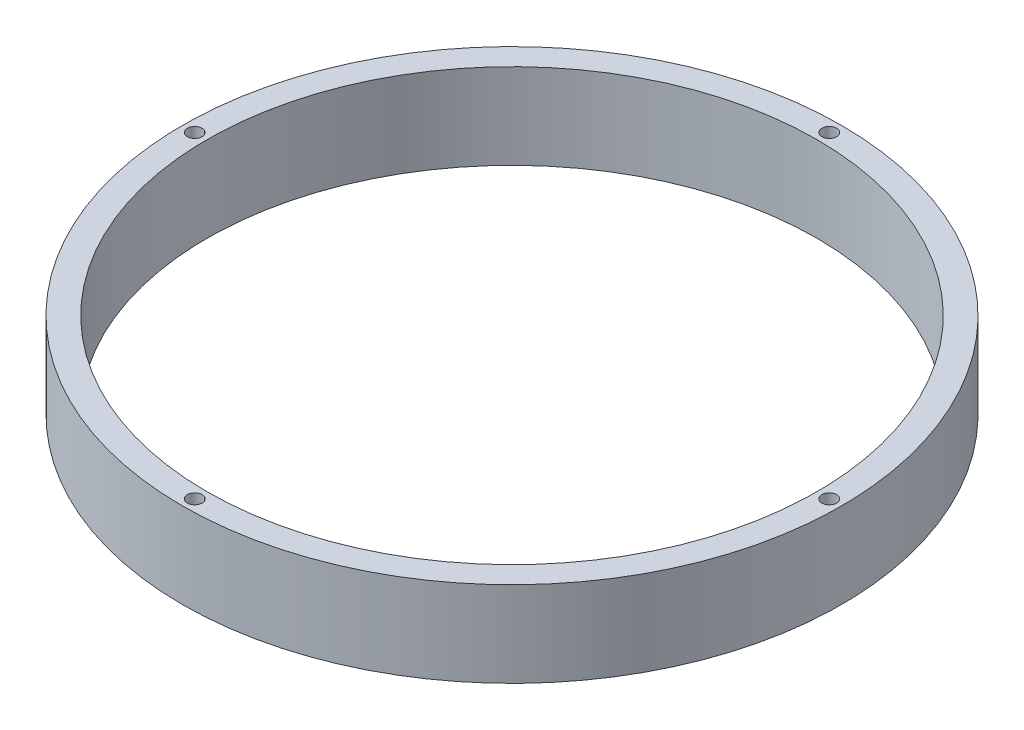
ISO-10303-21;
HEADER;
FILE_DESCRIPTION(('STEP AP214'),'2;1');
FILE_NAME('part.step','',(''),(''),'','','');
FILE_SCHEMA(('AUTOMOTIVE_DESIGN { 1 0 10303 214 1 1 1 1 }'));
ENDSEC;
DATA;
#1=APPLICATION_CONTEXT('core data for automotive mechanical design processes');
#2=APPLICATION_PROTOCOL_DEFINITION('international standard','automotive_design',2000,#1);
#3=PRODUCT_CONTEXT('',#1,'mechanical');
#4=PRODUCT('Part','Part','',(#3));
#5=PRODUCT_RELATED_PRODUCT_CATEGORY('part','',(#4));
#6=PRODUCT_DEFINITION_FORMATION('','',#4);
#7=PRODUCT_DEFINITION_CONTEXT('part definition',#1,'design');
#8=PRODUCT_DEFINITION('design','',#6,#7);
#9=PRODUCT_DEFINITION_SHAPE('','',#8);
#10=(LENGTH_UNIT() NAMED_UNIT(*) SI_UNIT(.MILLI.,.METRE.));
#11=(NAMED_UNIT(*) PLANE_ANGLE_UNIT() SI_UNIT($,.RADIAN.));
#12=(NAMED_UNIT(*) SI_UNIT($,.STERADIAN.) SOLID_ANGLE_UNIT());
#13=UNCERTAINTY_MEASURE_WITH_UNIT(LENGTH_MEASURE(1.E-05),#10,'distance_accuracy_value','');
#14=(GEOMETRIC_REPRESENTATION_CONTEXT(3) GLOBAL_UNCERTAINTY_ASSIGNED_CONTEXT((#13)) GLOBAL_UNIT_ASSIGNED_CONTEXT((#10,
#11,#12)) REPRESENTATION_CONTEXT('',''));
#15=CARTESIAN_POINT('',(0.,0.,0.));
#16=DIRECTION('',(0.,0.,1.));
#17=DIRECTION('',(1.,0.,0.));
#18=AXIS2_PLACEMENT_3D('',#15,#16,#17);
#19=CARTESIAN_POINT('',(2.94094773025341E-13,0.,2.16832645731163E-13));
#20=DIRECTION('',(0.,1.,0.));
#21=DIRECTION('',(0.,0.,1.));
#22=AXIS2_PLACEMENT_3D('',#19,#20,#21);
#23=PLANE('',#22);
#24=CARTESIAN_POINT('',(0.,0.,64.5));
#25=DIRECTION('',(0.,-1.,0.));
#26=DIRECTION('',(0.,0.,-1.));
#27=AXIS2_PLACEMENT_3D('',#24,#25,#26);
#28=CIRCLE('',#27,1.5);
#29=CARTESIAN_POINT('',(0.,0.,63.));
#30=VERTEX_POINT('',#29);
#31=EDGE_CURVE('E74',#30,#30,#28,.T.);
#32=ORIENTED_EDGE('',*,*,#31,.F.);
#33=EDGE_LOOP('',(#32));
#34=FACE_BOUND('',#33,.T.);
#35=CARTESIAN_POINT('',(64.5000000000001,0.,5.14876904683755E-13));
#36=DIRECTION('',(0.,-1.,0.));
#37=DIRECTION('',(0.,0.,-1.));
#38=AXIS2_PLACEMENT_3D('',#35,#36,#37);
#39=CIRCLE('',#38,1.49999999999998);
#40=CARTESIAN_POINT('',(64.5000000000001,0.,-1.49999999999947));
#41=VERTEX_POINT('',#40);
#42=EDGE_CURVE('E71',#41,#41,#39,.T.);
#43=ORIENTED_EDGE('',*,*,#42,.F.);
#44=EDGE_LOOP('',(#43));
#45=FACE_BOUND('',#44,.T.);
#46=CARTESIAN_POINT('',(5.96088517905183E-13,0.,-64.4999999999996));
#47=DIRECTION('',(0.,-1.,0.));
#48=DIRECTION('',(0.,0.,-1.));
#49=AXIS2_PLACEMENT_3D('',#46,#47,#48);
#50=CIRCLE('',#49,1.5);
#51=CARTESIAN_POINT('',(5.96088517905183E-13,0.,-65.9999999999996));
#52=VERTEX_POINT('',#51);
#53=EDGE_CURVE('E65',#52,#52,#50,.T.);
#54=ORIENTED_EDGE('',*,*,#53,.F.);
#55=EDGE_LOOP('',(#54));
#56=FACE_BOUND('',#55,.T.);
#57=CARTESIAN_POINT('',(-64.4999999999995,0.,0.));
#58=DIRECTION('',(0.,-1.,0.));
#59=DIRECTION('',(0.,0.,-1.));
#60=AXIS2_PLACEMENT_3D('',#57,#58,#59);
#61=CIRCLE('',#60,1.5);
#62=CARTESIAN_POINT('',(-64.4999999999995,0.,-1.50000000000009));
#63=VERTEX_POINT('',#62);
#64=EDGE_CURVE('E59',#63,#63,#61,.T.);
#65=ORIENTED_EDGE('',*,*,#64,.F.);
#66=EDGE_LOOP('',(#65));
#67=FACE_BOUND('',#66,.T.);
#68=CARTESIAN_POINT('',(2.94094773025341E-13,0.,2.16832645731163E-13));
#69=DIRECTION('',(0.,1.,0.));
#70=DIRECTION('',(0.,0.,1.));
#71=AXIS2_PLACEMENT_3D('',#68,#69,#70);
#72=CIRCLE('',#71,66.9999999999998);
#73=CARTESIAN_POINT('',(2.94094773025341E-13,0.,67.));
#74=VERTEX_POINT('',#73);
#75=EDGE_CURVE('E10',#74,#74,#72,.T.);
#76=ORIENTED_EDGE('',*,*,#75,.F.);
#77=EDGE_LOOP('',(#76));
#78=FACE_BOUND('',#77,.T.);
#79=CARTESIAN_POINT('',(2.94094773025341E-13,0.,2.16832645731163E-13));
#80=DIRECTION('',(0.,1.,0.));
#81=DIRECTION('',(0.,0.,1.));
#82=AXIS2_PLACEMENT_3D('',#79,#80,#81);
#83=CIRCLE('',#82,62.);
#84=CARTESIAN_POINT('',(2.94094773025341E-13,0.,62.0000000000002));
#85=VERTEX_POINT('',#84);
#86=EDGE_CURVE('E41',#85,#85,#83,.T.);
#87=ORIENTED_EDGE('',*,*,#86,.T.);
#88=EDGE_LOOP('',(#87));
#89=FACE_BOUND('',#88,.T.);
#90=ADVANCED_FACE('F37',(#34,#45,#56,#67,#78,#89),#23,.F.);
#91=CARTESIAN_POINT('',(2.94094773025341E-13,203.004617357994,2.16832645731163E-13));
#92=DIRECTION('',(0.,-1.,0.));
#93=DIRECTION('',(0.,0.,-1.));
#94=AXIS2_PLACEMENT_3D('',#91,#92,#93);
#95=CYLINDRICAL_SURFACE('',#94,66.9999999999998);
#96=ORIENTED_EDGE('',*,*,#75,.T.);
#97=EDGE_LOOP('',(#96));
#98=FACE_BOUND('',#97,.T.);
#99=CARTESIAN_POINT('',(2.76482157960954E-13,17.375,5.48466908477086E-13));
#100=DIRECTION('',(0.,1.,0.));
#101=DIRECTION('',(0.,0.,1.));
#102=AXIS2_PLACEMENT_3D('',#99,#100,#101);
#103=CIRCLE('',#102,66.9999999999997);
#104=CARTESIAN_POINT('',(2.76482157960954E-13,17.375,67.0000000000003));
#105=VERTEX_POINT('',#104);
#106=EDGE_CURVE('E48',#105,#105,#103,.T.);
#107=ORIENTED_EDGE('',*,*,#106,.F.);
#108=EDGE_LOOP('',(#107));
#109=FACE_BOUND('',#108,.T.);
#110=ADVANCED_FACE('F92',(#98,#109),#95,.T.);
#111=CARTESIAN_POINT('',(2.94094773025341E-13,203.004617357994,2.16832645731163E-13));
#112=DIRECTION('',(0.,-1.,0.));
#113=DIRECTION('',(0.,0.,-1.));
#114=AXIS2_PLACEMENT_3D('',#111,#112,#113);
#115=CYLINDRICAL_SURFACE('',#114,62.);
#116=ORIENTED_EDGE('',*,*,#86,.F.);
#117=EDGE_LOOP('',(#116));
#118=FACE_BOUND('',#117,.T.);
#119=CARTESIAN_POINT('',(2.76482157960954E-13,17.375,5.48466908477086E-13));
#120=DIRECTION('',(0.,1.,0.));
#121=DIRECTION('',(0.,0.,1.));
#122=AXIS2_PLACEMENT_3D('',#119,#120,#121);
#123=CIRCLE('',#122,62.0000000000002);
#124=CARTESIAN_POINT('',(2.76482157960954E-13,17.375,62.0000000000008));
#125=VERTEX_POINT('',#124);
#126=EDGE_CURVE('E50',#125,#125,#123,.T.);
#127=ORIENTED_EDGE('',*,*,#126,.T.);
#128=EDGE_LOOP('',(#127));
#129=FACE_BOUND('',#128,.T.);
#130=ADVANCED_FACE('F39',(#118,#129),#115,.F.);
#131=CARTESIAN_POINT('',(2.13761300327242E-12,17.375,3.76258481573311E-12));
#132=DIRECTION('',(0.,1.,0.));
#133=DIRECTION('',(0.,0.,1.));
#134=AXIS2_PLACEMENT_3D('',#131,#132,#133);
#135=PLANE('',#134);
#136=CARTESIAN_POINT('',(0.,17.375,64.5));
#137=DIRECTION('',(0.,-1.,0.));
#138=DIRECTION('',(0.,0.,-1.));
#139=AXIS2_PLACEMENT_3D('',#136,#137,#138);
#140=CIRCLE('',#139,1.5);
#141=CARTESIAN_POINT('',(0.,17.375,63.));
#142=VERTEX_POINT('',#141);
#143=EDGE_CURVE('E53',#142,#142,#140,.T.);
#144=ORIENTED_EDGE('',*,*,#143,.T.);
#145=EDGE_LOOP('',(#144));
#146=FACE_BOUND('',#145,.T.);
#147=CARTESIAN_POINT('',(64.5000000000001,17.375,5.14876904683755E-13));
#148=DIRECTION('',(0.,-1.,0.));
#149=DIRECTION('',(0.,0.,-1.));
#150=AXIS2_PLACEMENT_3D('',#147,#148,#149);
#151=CIRCLE('',#150,1.49999999999998);
#152=CARTESIAN_POINT('',(64.5000000000001,17.375,-1.49999999999947));
#153=VERTEX_POINT('',#152);
#154=EDGE_CURVE('E68',#153,#153,#151,.T.);
#155=ORIENTED_EDGE('',*,*,#154,.T.);
#156=EDGE_LOOP('',(#155));
#157=FACE_BOUND('',#156,.T.);
#158=CARTESIAN_POINT('',(5.96088517905183E-13,17.375,-64.4999999999996));
#159=DIRECTION('',(0.,-1.,0.));
#160=DIRECTION('',(0.,0.,-1.));
#161=AXIS2_PLACEMENT_3D('',#158,#159,#160);
#162=CIRCLE('',#161,1.5);
#163=CARTESIAN_POINT('',(5.96088517905183E-13,17.375,-65.9999999999996));
#164=VERTEX_POINT('',#163);
#165=EDGE_CURVE('E62',#164,#164,#162,.T.);
#166=ORIENTED_EDGE('',*,*,#165,.T.);
#167=EDGE_LOOP('',(#166));
#168=FACE_BOUND('',#167,.T.);
#169=CARTESIAN_POINT('',(-64.4999999999995,17.375,0.));
#170=DIRECTION('',(0.,-1.,0.));
#171=DIRECTION('',(0.,0.,-1.));
#172=AXIS2_PLACEMENT_3D('',#169,#170,#171);
#173=CIRCLE('',#172,1.5);
#174=CARTESIAN_POINT('',(-64.4999999999995,17.375,-1.50000000000009));
#175=VERTEX_POINT('',#174);
#176=EDGE_CURVE('E56',#175,#175,#173,.T.);
#177=ORIENTED_EDGE('',*,*,#176,.T.);
#178=EDGE_LOOP('',(#177));
#179=FACE_BOUND('',#178,.T.);
#180=ORIENTED_EDGE('',*,*,#126,.F.);
#181=EDGE_LOOP('',(#180));
#182=FACE_BOUND('',#181,.T.);
#183=ORIENTED_EDGE('',*,*,#106,.T.);
#184=EDGE_LOOP('',(#183));
#185=FACE_BOUND('',#184,.T.);
#186=ADVANCED_FACE('F80',(#146,#157,#168,#179,#182,#185),#135,.T.);
#187=CARTESIAN_POINT('',(-64.4999999999995,17.375,0.));
#188=DIRECTION('',(0.,-1.,0.));
#189=DIRECTION('',(0.,0.,-1.));
#190=AXIS2_PLACEMENT_3D('',#187,#188,#189);
#191=CYLINDRICAL_SURFACE('',#190,1.5);
#192=ORIENTED_EDGE('',*,*,#176,.F.);
#193=EDGE_LOOP('',(#192));
#194=FACE_BOUND('',#193,.T.);
#195=ORIENTED_EDGE('',*,*,#64,.T.);
#196=EDGE_LOOP('',(#195));
#197=FACE_BOUND('',#196,.T.);
#198=ADVANCED_FACE('F109',(#194,#197),#191,.F.);
#199=CARTESIAN_POINT('',(5.96088517905183E-13,17.375,-64.4999999999996));
#200=DIRECTION('',(0.,-1.,0.));
#201=DIRECTION('',(0.,0.,-1.));
#202=AXIS2_PLACEMENT_3D('',#199,#200,#201);
#203=CYLINDRICAL_SURFACE('',#202,1.5);
#204=ORIENTED_EDGE('',*,*,#165,.F.);
#205=EDGE_LOOP('',(#204));
#206=FACE_BOUND('',#205,.T.);
#207=ORIENTED_EDGE('',*,*,#53,.T.);
#208=EDGE_LOOP('',(#207));
#209=FACE_BOUND('',#208,.T.);
#210=ADVANCED_FACE('F119',(#206,#209),#203,.F.);
#211=CARTESIAN_POINT('',(64.5000000000001,17.375,5.14876904683755E-13));
#212=DIRECTION('',(0.,-1.,0.));
#213=DIRECTION('',(0.,0.,-1.));
#214=AXIS2_PLACEMENT_3D('',#211,#212,#213);
#215=CYLINDRICAL_SURFACE('',#214,1.49999999999998);
#216=ORIENTED_EDGE('',*,*,#154,.F.);
#217=EDGE_LOOP('',(#216));
#218=FACE_BOUND('',#217,.T.);
#219=ORIENTED_EDGE('',*,*,#42,.T.);
#220=EDGE_LOOP('',(#219));
#221=FACE_BOUND('',#220,.T.);
#222=ADVANCED_FACE('F86',(#218,#221),#215,.F.);
#223=CARTESIAN_POINT('',(0.,17.375,64.5));
#224=DIRECTION('',(0.,-1.,0.));
#225=DIRECTION('',(0.,0.,-1.));
#226=AXIS2_PLACEMENT_3D('',#223,#224,#225);
#227=CYLINDRICAL_SURFACE('',#226,1.5);
#228=ORIENTED_EDGE('',*,*,#143,.F.);
#229=EDGE_LOOP('',(#228));
#230=FACE_BOUND('',#229,.T.);
#231=ORIENTED_EDGE('',*,*,#31,.T.);
#232=EDGE_LOOP('',(#231));
#233=FACE_BOUND('',#232,.T.);
#234=ADVANCED_FACE('F83',(#230,#233),#227,.F.);
#235=CLOSED_SHELL('',(#90,#110,#130,#186,#198,#210,#222,#234));
#236=MANIFOLD_SOLID_BREP('B2',#235);
#237=ADVANCED_BREP_SHAPE_REPRESENTATION('',(#18,#236),#14);
#238=SHAPE_DEFINITION_REPRESENTATION(#9,#237);
ENDSEC;
END-ISO-10303-21;
